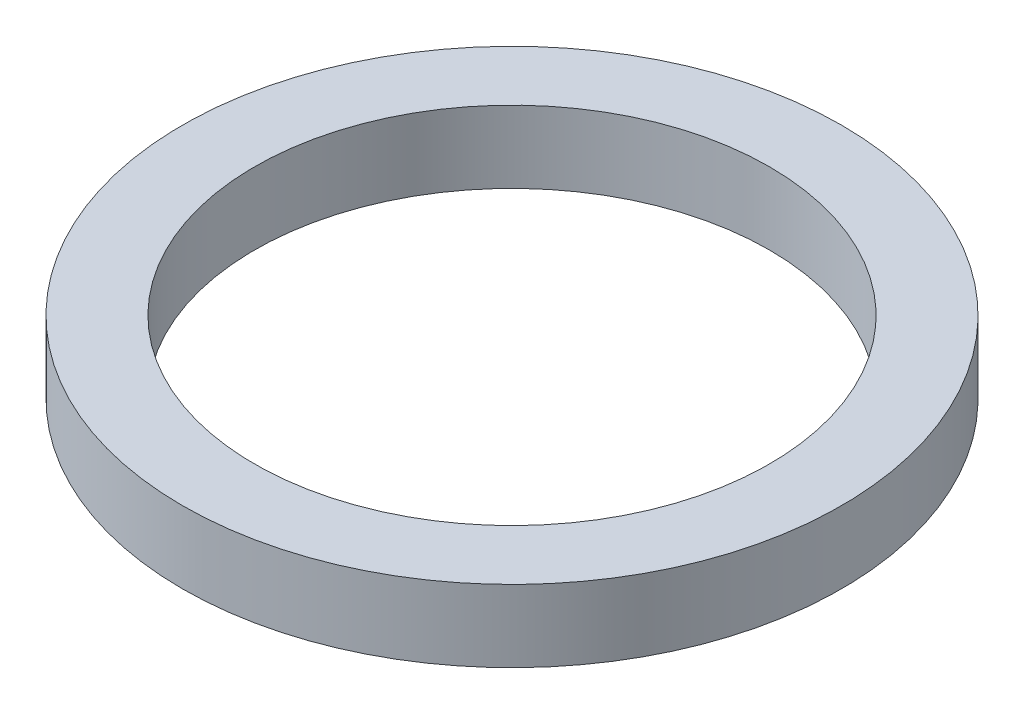
ISO-10303-21;
HEADER;
FILE_DESCRIPTION(('STEP AP214'),'2;1');
FILE_NAME('part.step','',(''),(''),'','','');
FILE_SCHEMA(('AUTOMOTIVE_DESIGN { 1 0 10303 214 1 1 1 1 }'));
ENDSEC;
DATA;
#1=APPLICATION_CONTEXT('core data for automotive mechanical design processes');
#2=APPLICATION_PROTOCOL_DEFINITION('international standard','automotive_design',2000,#1);
#3=PRODUCT_CONTEXT('',#1,'mechanical');
#4=PRODUCT('Part','Part','',(#3));
#5=PRODUCT_RELATED_PRODUCT_CATEGORY('part','',(#4));
#6=PRODUCT_DEFINITION_FORMATION('','',#4);
#7=PRODUCT_DEFINITION_CONTEXT('part definition',#1,'design');
#8=PRODUCT_DEFINITION('design','',#6,#7);
#9=PRODUCT_DEFINITION_SHAPE('','',#8);
#10=(LENGTH_UNIT() NAMED_UNIT(*) SI_UNIT(.MILLI.,.METRE.));
#11=(NAMED_UNIT(*) PLANE_ANGLE_UNIT() SI_UNIT($,.RADIAN.));
#12=(NAMED_UNIT(*) SI_UNIT($,.STERADIAN.) SOLID_ANGLE_UNIT());
#13=UNCERTAINTY_MEASURE_WITH_UNIT(LENGTH_MEASURE(1.E-05),#10,'distance_accuracy_value','');
#14=(GEOMETRIC_REPRESENTATION_CONTEXT(3) GLOBAL_UNCERTAINTY_ASSIGNED_CONTEXT((#13)) GLOBAL_UNIT_ASSIGNED_CONTEXT((#10,
#11,#12)) REPRESENTATION_CONTEXT('',''));
#15=CARTESIAN_POINT('',(0.,0.,0.));
#16=DIRECTION('',(0.,0.,1.));
#17=DIRECTION('',(1.,0.,0.));
#18=AXIS2_PLACEMENT_3D('',#15,#16,#17);
#19=CARTESIAN_POINT('',(-16.,0.,0.));
#20=DIRECTION('',(0.,-1.,0.));
#21=DIRECTION('',(0.,0.,-1.));
#22=AXIS2_PLACEMENT_3D('',#19,#20,#21);
#23=CYLINDRICAL_SURFACE('',#22,16.);
#24=CARTESIAN_POINT('',(-16.,3.5,0.));
#25=DIRECTION('',(0.,-1.,0.));
#26=DIRECTION('',(0.,0.,-1.));
#27=AXIS2_PLACEMENT_3D('',#24,#25,#26);
#28=CIRCLE('',#27,16.);
#29=CARTESIAN_POINT('',(-16.,3.5,-16.));
#30=VERTEX_POINT('',#29);
#31=EDGE_CURVE('E10',#30,#30,#28,.T.);
#32=ORIENTED_EDGE('',*,*,#31,.T.);
#33=EDGE_LOOP('',(#32));
#34=FACE_BOUND('',#33,.T.);
#35=CARTESIAN_POINT('',(-16.,0.,0.));
#36=DIRECTION('',(0.,-1.,0.));
#37=DIRECTION('',(0.,0.,-1.));
#38=AXIS2_PLACEMENT_3D('',#35,#36,#37);
#39=CIRCLE('',#38,16.);
#40=CARTESIAN_POINT('',(-16.,0.,-16.));
#41=VERTEX_POINT('',#40);
#42=EDGE_CURVE('E49',#41,#41,#39,.T.);
#43=ORIENTED_EDGE('',*,*,#42,.F.);
#44=EDGE_LOOP('',(#43));
#45=FACE_BOUND('',#44,.T.);
#46=ADVANCED_FACE('F35',(#34,#45),#23,.T.);
#47=CARTESIAN_POINT('',(-3.50000000000001,3.5,0.));
#48=DIRECTION('',(0.,-1.,0.));
#49=DIRECTION('',(0.,0.,-1.));
#50=AXIS2_PLACEMENT_3D('',#47,#48,#49);
#51=PLANE('',#50);
#52=ORIENTED_EDGE('',*,*,#31,.F.);
#53=EDGE_LOOP('',(#52));
#54=FACE_BOUND('',#53,.T.);
#55=CARTESIAN_POINT('',(-16.,3.5,0.));
#56=DIRECTION('',(0.,-1.,0.));
#57=DIRECTION('',(0.,0.,-1.));
#58=AXIS2_PLACEMENT_3D('',#55,#56,#57);
#59=CIRCLE('',#58,12.5);
#60=CARTESIAN_POINT('',(-16.,3.5,-12.5));
#61=VERTEX_POINT('',#60);
#62=EDGE_CURVE('E41',#61,#61,#59,.T.);
#63=ORIENTED_EDGE('',*,*,#62,.T.);
#64=EDGE_LOOP('',(#63));
#65=FACE_BOUND('',#64,.T.);
#66=ADVANCED_FACE('F58',(#54,#65),#51,.F.);
#67=CARTESIAN_POINT('',(-16.,0.,0.));
#68=DIRECTION('',(0.,-1.,0.));
#69=DIRECTION('',(0.,0.,-1.));
#70=AXIS2_PLACEMENT_3D('',#67,#68,#69);
#71=CYLINDRICAL_SURFACE('',#70,12.5);
#72=CARTESIAN_POINT('',(-16.,0.,0.));
#73=DIRECTION('',(0.,-1.,0.));
#74=DIRECTION('',(0.,0.,-1.));
#75=AXIS2_PLACEMENT_3D('',#72,#73,#74);
#76=CIRCLE('',#75,12.5);
#77=CARTESIAN_POINT('',(-16.,0.,-12.5));
#78=VERTEX_POINT('',#77);
#79=EDGE_CURVE('E45',#78,#78,#76,.T.);
#80=ORIENTED_EDGE('',*,*,#79,.T.);
#81=EDGE_LOOP('',(#80));
#82=FACE_BOUND('',#81,.T.);
#83=ORIENTED_EDGE('',*,*,#62,.F.);
#84=EDGE_LOOP('',(#83));
#85=FACE_BOUND('',#84,.T.);
#86=ADVANCED_FACE('F62',(#82,#85),#71,.F.);
#87=CARTESIAN_POINT('',(0.,0.,0.));
#88=DIRECTION('',(0.,1.,0.));
#89=DIRECTION('',(0.,0.,1.));
#90=AXIS2_PLACEMENT_3D('',#87,#88,#89);
#91=PLANE('',#90);
#92=ORIENTED_EDGE('',*,*,#79,.F.);
#93=EDGE_LOOP('',(#92));
#94=FACE_BOUND('',#93,.T.);
#95=ORIENTED_EDGE('',*,*,#42,.T.);
#96=EDGE_LOOP('',(#95));
#97=FACE_BOUND('',#96,.T.);
#98=ADVANCED_FACE('F55',(#94,#97),#91,.F.);
#99=CLOSED_SHELL('',(#46,#66,#86,#98));
#100=MANIFOLD_SOLID_BREP('B2',#99);
#101=ADVANCED_BREP_SHAPE_REPRESENTATION('',(#18,#100),#14);
#102=SHAPE_DEFINITION_REPRESENTATION(#9,#101);
ENDSEC;
END-ISO-10303-21;
